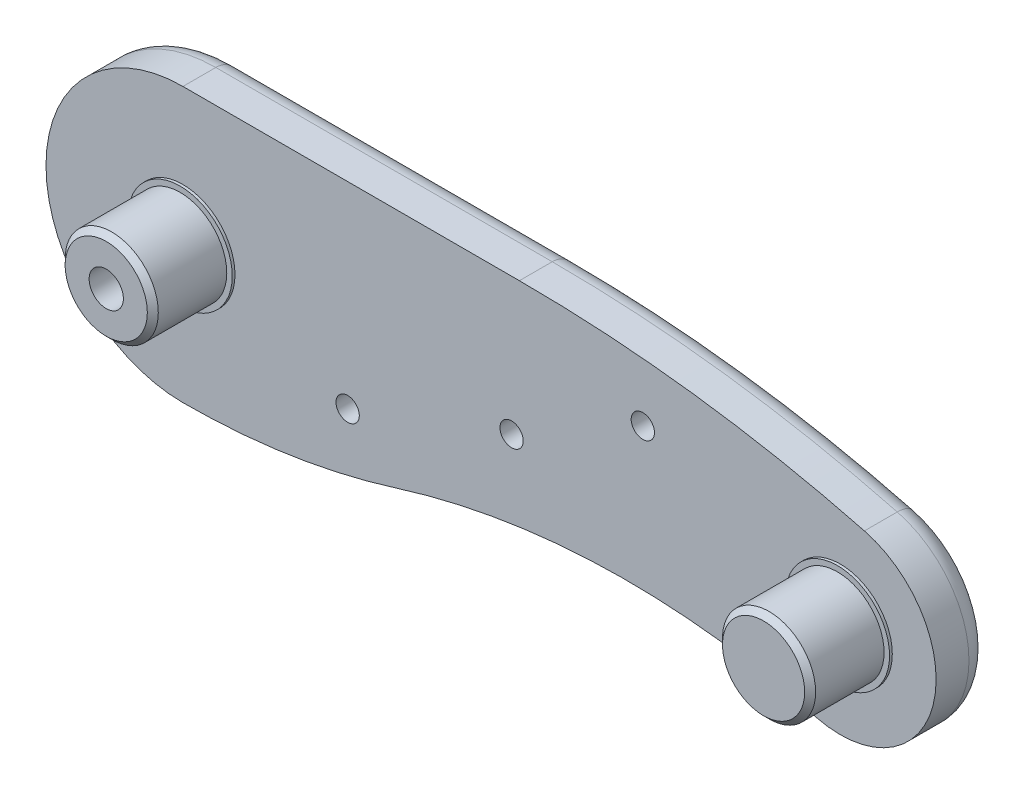
ISO-10303-21;
HEADER;
FILE_DESCRIPTION(('STEP AP214'),'2;1');
FILE_NAME('part.step','',(''),(''),'','','');
FILE_SCHEMA(('AUTOMOTIVE_DESIGN { 1 0 10303 214 1 1 1 1 }'));
ENDSEC;
DATA;
#1=APPLICATION_CONTEXT('core data for automotive mechanical design processes');
#2=APPLICATION_PROTOCOL_DEFINITION('international standard','automotive_design',2000,#1);
#3=PRODUCT_CONTEXT('',#1,'mechanical');
#4=PRODUCT('Part','Part','',(#3));
#5=PRODUCT_RELATED_PRODUCT_CATEGORY('part','',(#4));
#6=PRODUCT_DEFINITION_FORMATION('','',#4);
#7=PRODUCT_DEFINITION_CONTEXT('part definition',#1,'design');
#8=PRODUCT_DEFINITION('design','',#6,#7);
#9=PRODUCT_DEFINITION_SHAPE('','',#8);
#10=(LENGTH_UNIT() NAMED_UNIT(*) SI_UNIT(.MILLI.,.METRE.));
#11=(NAMED_UNIT(*) PLANE_ANGLE_UNIT() SI_UNIT($,.RADIAN.));
#12=(NAMED_UNIT(*) SI_UNIT($,.STERADIAN.) SOLID_ANGLE_UNIT());
#13=UNCERTAINTY_MEASURE_WITH_UNIT(LENGTH_MEASURE(1.E-05),#10,'distance_accuracy_value','');
#14=(GEOMETRIC_REPRESENTATION_CONTEXT(3) GLOBAL_UNCERTAINTY_ASSIGNED_CONTEXT((#13)) GLOBAL_UNIT_ASSIGNED_CONTEXT((#10,
#11,#12)) REPRESENTATION_CONTEXT('',''));
#15=CARTESIAN_POINT('',(0.,0.,0.));
#16=DIRECTION('',(0.,0.,1.));
#17=DIRECTION('',(1.,0.,0.));
#18=AXIS2_PLACEMENT_3D('',#15,#16,#17);
#19=CARTESIAN_POINT('',(0.,0.,-4.));
#20=DIRECTION('',(0.,0.,-1.));
#21=DIRECTION('',(-1.,0.,0.));
#22=AXIS2_PLACEMENT_3D('',#19,#20,#21);
#23=PLANE('',#22);
#24=CARTESIAN_POINT('',(0.,0.,-4.));
#25=DIRECTION('',(0.,0.,-1.));
#26=DIRECTION('',(-1.,0.,0.));
#27=AXIS2_PLACEMENT_3D('',#24,#25,#26);
#28=CIRCLE('',#27,18.);
#29=CARTESIAN_POINT('',(-18.,0.,-4.));
#30=VERTEX_POINT('',#29);
#31=EDGE_CURVE('E57',#30,#30,#28,.F.);
#32=ORIENTED_EDGE('',*,*,#31,.T.);
#33=EDGE_LOOP('',(#32));
#34=FACE_BOUND('',#33,.T.);
#35=CARTESIAN_POINT('',(30.0701638651491,-10.9446445864214,-4.));
#36=DIRECTION('',(0.,0.,-1.));
#37=DIRECTION('',(-1.,0.,0.));
#38=AXIS2_PLACEMENT_3D('',#35,#36,#37);
#39=CIRCLE('',#38,3.75);
#40=CARTESIAN_POINT('',(26.3201638651491,-10.9446445864214,-4.));
#41=VERTEX_POINT('',#40);
#42=EDGE_CURVE('E379',#41,#41,#39,.T.);
#43=ORIENTED_EDGE('',*,*,#42,.F.);
#44=EDGE_LOOP('',(#43));
#45=FACE_BOUND('',#44,.T.);
#46=CARTESIAN_POINT('',(60.,0.,-4.));
#47=DIRECTION('',(0.,0.,-1.));
#48=DIRECTION('',(-1.,0.,0.));
#49=AXIS2_PLACEMENT_3D('',#46,#47,#48);
#50=CIRCLE('',#49,3.75000000000001);
#51=CARTESIAN_POINT('',(56.25,0.,-4.));
#52=VERTEX_POINT('',#51);
#53=EDGE_CURVE('E371',#52,#52,#50,.T.);
#54=ORIENTED_EDGE('',*,*,#53,.F.);
#55=EDGE_LOOP('',(#54));
#56=FACE_BOUND('',#55,.T.);
#57=CARTESIAN_POINT('',(83.9535089505867,13.2969295284196,-4.));
#58=DIRECTION('',(0.,0.,-1.));
#59=DIRECTION('',(-1.,0.,0.));
#60=AXIS2_PLACEMENT_3D('',#57,#58,#59);
#61=CIRCLE('',#60,3.75000000000001);
#62=CARTESIAN_POINT('',(80.2035089505867,13.2969295284196,-4.));
#63=VERTEX_POINT('',#62);
#64=EDGE_CURVE('E367',#63,#63,#61,.T.);
#65=ORIENTED_EDGE('',*,*,#64,.F.);
#66=EDGE_LOOP('',(#65));
#67=FACE_BOUND('',#66,.T.);
#68=CARTESIAN_POINT('',(0.,105.,-4.));
#69=DIRECTION('',(0.,0.,-1.));
#70=DIRECTION('',(-1.,0.,0.));
#71=AXIS2_PLACEMENT_3D('',#68,#69,#70);
#72=CIRCLE('',#71,126.);
#73=CARTESIAN_POINT('',(37.7742430285016,-15.2044365388553,-4.));
#74=VERTEX_POINT('',#73);
#75=CARTESIAN_POINT('',(0.,-21.,-4.));
#76=VERTEX_POINT('',#75);
#77=EDGE_CURVE('E210',#74,#76,#72,.T.);
#78=ORIENTED_EDGE('',*,*,#77,.T.);
#79=CARTESIAN_POINT('',(0.,0.,-4.));
#80=DIRECTION('',(0.,0.,-1.));
#81=DIRECTION('',(-1.,0.,0.));
#82=AXIS2_PLACEMENT_3D('',#79,#80,#81);
#83=CIRCLE('',#82,21.);
#84=CARTESIAN_POINT('',(0.,21.,-4.));
#85=VERTEX_POINT('',#84);
#86=EDGE_CURVE('E213',#76,#85,#83,.T.);
#87=ORIENTED_EDGE('',*,*,#86,.T.);
#88=DIRECTION('',(1.,0.,0.));
#89=VECTOR('',#88,1.);
#90=CARTESIAN_POINT('',(0.,21.,-4.));
#91=LINE('',#90,#89);
#92=CARTESIAN_POINT('',(61.4231274307002,21.,-4.));
#93=VERTEX_POINT('',#92);
#94=EDGE_CURVE('E134',#85,#93,#91,.T.);
#95=ORIENTED_EDGE('',*,*,#94,.T.);
#96=CARTESIAN_POINT('',(61.4231274307002,-225.,-4.));
#97=DIRECTION('',(0.,0.,-1.));
#98=DIRECTION('',(-1.,0.,0.));
#99=AXIS2_PLACEMENT_3D('',#96,#97,#98);
#100=CIRCLE('',#99,246.);
#101=CARTESIAN_POINT('',(123.401237762088,13.0645161290323,-4.));
#102=VERTEX_POINT('',#101);
#103=EDGE_CURVE('E201',#93,#102,#100,.T.);
#104=ORIENTED_EDGE('',*,*,#103,.T.);
#105=CARTESIAN_POINT('',(120.,0.,-4.));
#106=DIRECTION('',(0.,0.,-1.));
#107=DIRECTION('',(-1.,0.,0.));
#108=AXIS2_PLACEMENT_3D('',#105,#106,#107);
#109=CIRCLE('',#108,13.5);
#110=CARTESIAN_POINT('',(116.652411984827,-13.0783658948918,-4.));
#111=VERTEX_POINT('',#110);
#112=EDGE_CURVE('E204',#102,#111,#109,.T.);
#113=ORIENTED_EDGE('',*,*,#112,.T.);
#114=CARTESIAN_POINT('',(80.9448064896462,-152.580935440404,-4.));
#115=DIRECTION('',(0.,0.,-1.));
#116=DIRECTION('',(-1.,0.,0.));
#117=AXIS2_PLACEMENT_3D('',#114,#115,#116);
#118=CIRCLE('',#117,144.);
#119=EDGE_CURVE('E207',#111,#74,#118,.F.);
#120=ORIENTED_EDGE('',*,*,#119,.T.);
#121=EDGE_LOOP('',(#78,#87,#95,#104,#113,#120));
#122=FACE_BOUND('',#121,.T.);
#123=ADVANCED_FACE('F47',(#34,#45,#56,#67,#122),#23,.T.);
#124=CARTESIAN_POINT('',(0.,0.,20.));
#125=DIRECTION('',(0.,0.,-1.));
#126=DIRECTION('',(-1.,0.,0.));
#127=AXIS2_PLACEMENT_3D('',#124,#125,#126);
#128=CYLINDRICAL_SURFACE('',#127,1.625);
#129=CARTESIAN_POINT('',(0.,0.,0.));
#130=DIRECTION('',(0.,0.,-1.));
#131=DIRECTION('',(-1.,0.,0.));
#132=AXIS2_PLACEMENT_3D('',#129,#130,#131);
#133=CIRCLE('',#132,1.625);
#134=CARTESIAN_POINT('',(-1.625,0.,0.));
#135=VERTEX_POINT('',#134);
#136=EDGE_CURVE('E275',#135,#135,#133,.T.);
#137=ORIENTED_EDGE('',*,*,#136,.T.);
#138=EDGE_LOOP('',(#137));
#139=FACE_BOUND('',#138,.T.);
#140=CARTESIAN_POINT('',(0.,0.,3.));
#141=DIRECTION('',(0.,0.,1.));
#142=DIRECTION('',(1.,0.,0.));
#143=AXIS2_PLACEMENT_3D('',#140,#141,#142);
#144=CIRCLE('',#143,1.625);
#145=CARTESIAN_POINT('',(1.625,0.,3.));
#146=VERTEX_POINT('',#145);
#147=EDGE_CURVE('E272',#146,#146,#144,.F.);
#148=ORIENTED_EDGE('',*,*,#147,.F.);
#149=EDGE_LOOP('',(#148));
#150=FACE_BOUND('',#149,.T.);
#151=ADVANCED_FACE('F402',(#139,#150),#128,.F.);
#152=CARTESIAN_POINT('',(0.,0.,6.));
#153=DIRECTION('',(0.,0.,1.));
#154=DIRECTION('',(1.,0.,0.));
#155=AXIS2_PLACEMENT_3D('',#152,#153,#154);
#156=PLANE('',#155);
#157=CARTESIAN_POINT('',(0.,0.,6.));
#158=DIRECTION('',(0.,0.,1.));
#159=DIRECTION('',(1.,0.,0.));
#160=AXIS2_PLACEMENT_3D('',#157,#158,#159);
#161=CIRCLE('',#160,9.5);
#162=CARTESIAN_POINT('',(9.5,0.,6.));
#163=VERTEX_POINT('',#162);
#164=EDGE_CURVE('E357',#163,#163,#161,.T.);
#165=ORIENTED_EDGE('',*,*,#164,.F.);
#166=EDGE_LOOP('',(#165));
#167=FACE_BOUND('',#166,.T.);
#168=CARTESIAN_POINT('',(83.9535089505867,13.2969295284196,6.));
#169=DIRECTION('',(0.,0.,1.));
#170=DIRECTION('',(1.,0.,0.));
#171=AXIS2_PLACEMENT_3D('',#168,#169,#170);
#172=CIRCLE('',#171,2.125);
#173=CARTESIAN_POINT('',(86.0785089505867,13.2969295284196,6.));
#174=VERTEX_POINT('',#173);
#175=EDGE_CURVE('E155',#174,#174,#172,.T.);
#176=ORIENTED_EDGE('',*,*,#175,.F.);
#177=EDGE_LOOP('',(#176));
#178=FACE_BOUND('',#177,.T.);
#179=CARTESIAN_POINT('',(60.,0.,6.));
#180=DIRECTION('',(0.,0.,1.));
#181=DIRECTION('',(1.,0.,0.));
#182=AXIS2_PLACEMENT_3D('',#179,#180,#181);
#183=CIRCLE('',#182,2.125);
#184=CARTESIAN_POINT('',(62.125,0.,6.));
#185=VERTEX_POINT('',#184);
#186=EDGE_CURVE('E389',#185,#185,#183,.T.);
#187=ORIENTED_EDGE('',*,*,#186,.F.);
#188=EDGE_LOOP('',(#187));
#189=FACE_BOUND('',#188,.T.);
#190=CARTESIAN_POINT('',(30.0701638651491,-10.9446445864214,6.));
#191=DIRECTION('',(0.,0.,1.));
#192=DIRECTION('',(1.,0.,0.));
#193=AXIS2_PLACEMENT_3D('',#190,#191,#192);
#194=CIRCLE('',#193,2.125);
#195=CARTESIAN_POINT('',(32.1951638651491,-10.9446445864214,6.));
#196=VERTEX_POINT('',#195);
#197=EDGE_CURVE('E198',#196,#196,#194,.T.);
#198=ORIENTED_EDGE('',*,*,#197,.F.);
#199=EDGE_LOOP('',(#198));
#200=FACE_BOUND('',#199,.T.);
#201=DIRECTION('',(1.,0.,0.));
#202=VECTOR('',#201,1.);
#203=CARTESIAN_POINT('',(0.,25.,6.));
#204=LINE('',#203,#202);
#205=CARTESIAN_POINT('',(0.,25.,6.));
#206=VERTEX_POINT('',#205);
#207=CARTESIAN_POINT('',(61.4231274307002,25.,6.));
#208=VERTEX_POINT('',#207);
#209=EDGE_CURVE('E126',#206,#208,#204,.T.);
#210=ORIENTED_EDGE('',*,*,#209,.F.);
#211=CARTESIAN_POINT('',(0.,0.,6.));
#212=DIRECTION('',(0.,0.,1.));
#213=DIRECTION('',(1.,0.,0.));
#214=AXIS2_PLACEMENT_3D('',#211,#212,#213);
#215=CIRCLE('',#214,25.);
#216=CARTESIAN_POINT('',(0.,-25.,6.));
#217=VERTEX_POINT('',#216);
#218=EDGE_CURVE('E138',#206,#217,#215,.T.);
#219=ORIENTED_EDGE('',*,*,#218,.T.);
#220=CARTESIAN_POINT('',(0.,105.,6.));
#221=DIRECTION('',(0.,0.,1.));
#222=DIRECTION('',(1.,0.,0.));
#223=AXIS2_PLACEMENT_3D('',#220,#221,#222);
#224=CIRCLE('',#223,130.);
#225=CARTESIAN_POINT('',(38.9734253468667,-19.0204503972317,6.));
#226=VERTEX_POINT('',#225);
#227=EDGE_CURVE('E144',#217,#226,#224,.T.);
#228=ORIENTED_EDGE('',*,*,#227,.T.);
#229=CARTESIAN_POINT('',(80.9448064896462,-152.580935440404,6.));
#230=DIRECTION('',(0.,0.,1.));
#231=DIRECTION('',(1.,0.,0.));
#232=AXIS2_PLACEMENT_3D('',#229,#230,#231);
#233=CIRCLE('',#232,140.);
#234=CARTESIAN_POINT('',(115.660534054405,-16.9534372711561,6.));
#235=VERTEX_POINT('',#234);
#236=EDGE_CURVE('E161',#235,#226,#233,.T.);
#237=ORIENTED_EDGE('',*,*,#236,.F.);
#238=CARTESIAN_POINT('',(120.,0.,6.));
#239=DIRECTION('',(0.,0.,1.));
#240=DIRECTION('',(1.,0.,0.));
#241=AXIS2_PLACEMENT_3D('',#238,#239,#240);
#242=CIRCLE('',#241,17.5);
#243=CARTESIAN_POINT('',(124.409011913818,16.9354838709678,6.));
#244=VERTEX_POINT('',#243);
#245=EDGE_CURVE('E165',#235,#244,#242,.T.);
#246=ORIENTED_EDGE('',*,*,#245,.T.);
#247=CARTESIAN_POINT('',(61.4231274307002,-225.,6.));
#248=DIRECTION('',(0.,0.,1.));
#249=DIRECTION('',(1.,0.,0.));
#250=AXIS2_PLACEMENT_3D('',#247,#248,#249);
#251=CIRCLE('',#250,250.);
#252=EDGE_CURVE('E149',#208,#244,#251,.F.);
#253=ORIENTED_EDGE('',*,*,#252,.F.);
#254=EDGE_LOOP('',(#210,#219,#228,#237,#246,#253));
#255=FACE_BOUND('',#254,.T.);
#256=CARTESIAN_POINT('',(120.,0.,6.));
#257=DIRECTION('',(0.,0.,1.));
#258=DIRECTION('',(1.,0.,0.));
#259=AXIS2_PLACEMENT_3D('',#256,#257,#258);
#260=CIRCLE('',#259,9.50000000000001);
#261=CARTESIAN_POINT('',(129.5,0.,6.));
#262=VERTEX_POINT('',#261);
#263=EDGE_CURVE('E342',#262,#262,#260,.T.);
#264=ORIENTED_EDGE('',*,*,#263,.F.);
#265=EDGE_LOOP('',(#264));
#266=FACE_BOUND('',#265,.T.);
#267=ADVANCED_FACE('F146',(#167,#178,#189,#200,#255,#266),#156,.T.);
#268=CARTESIAN_POINT('',(30.0701638651491,-10.9446445864214,20.));
#269=DIRECTION('',(0.,0.,-1.));
#270=DIRECTION('',(-1.,0.,0.));
#271=AXIS2_PLACEMENT_3D('',#268,#269,#270);
#272=CYLINDRICAL_SURFACE('',#271,2.125);
#273=ORIENTED_EDGE('',*,*,#197,.T.);
#274=EDGE_LOOP('',(#273));
#275=FACE_BOUND('',#274,.T.);
#276=CARTESIAN_POINT('',(30.0701638651491,-10.9446445864214,0.25));
#277=DIRECTION('',(0.,0.,-1.));
#278=DIRECTION('',(-1.,0.,0.));
#279=AXIS2_PLACEMENT_3D('',#276,#277,#278);
#280=CIRCLE('',#279,2.125);
#281=CARTESIAN_POINT('',(27.9451638651491,-10.9446445864214,0.25));
#282=VERTEX_POINT('',#281);
#283=EDGE_CURVE('E194',#282,#282,#280,.F.);
#284=ORIENTED_EDGE('',*,*,#283,.F.);
#285=EDGE_LOOP('',(#284));
#286=FACE_BOUND('',#285,.T.);
#287=ADVANCED_FACE('F401',(#275,#286),#272,.F.);
#288=CARTESIAN_POINT('',(60.,0.,20.));
#289=DIRECTION('',(0.,0.,-1.));
#290=DIRECTION('',(-1.,0.,0.));
#291=AXIS2_PLACEMENT_3D('',#288,#289,#290);
#292=CYLINDRICAL_SURFACE('',#291,2.125);
#293=ORIENTED_EDGE('',*,*,#186,.T.);
#294=EDGE_LOOP('',(#293));
#295=FACE_BOUND('',#294,.T.);
#296=CARTESIAN_POINT('',(60.,0.,0.25));
#297=DIRECTION('',(0.,0.,-1.));
#298=DIRECTION('',(-1.,0.,0.));
#299=AXIS2_PLACEMENT_3D('',#296,#297,#298);
#300=CIRCLE('',#299,2.125);
#301=CARTESIAN_POINT('',(57.875,0.,0.25));
#302=VERTEX_POINT('',#301);
#303=EDGE_CURVE('E189',#302,#302,#300,.F.);
#304=ORIENTED_EDGE('',*,*,#303,.F.);
#305=EDGE_LOOP('',(#304));
#306=FACE_BOUND('',#305,.T.);
#307=ADVANCED_FACE('F411',(#295,#306),#292,.F.);
#308=CARTESIAN_POINT('',(83.9535089505867,13.2969295284196,20.));
#309=DIRECTION('',(0.,0.,-1.));
#310=DIRECTION('',(-1.,0.,0.));
#311=AXIS2_PLACEMENT_3D('',#308,#309,#310);
#312=CYLINDRICAL_SURFACE('',#311,2.125);
#313=ORIENTED_EDGE('',*,*,#175,.T.);
#314=EDGE_LOOP('',(#313));
#315=FACE_BOUND('',#314,.T.);
#316=CARTESIAN_POINT('',(83.9535089505867,13.2969295284196,0.25));
#317=DIRECTION('',(0.,0.,-1.));
#318=DIRECTION('',(-1.,0.,0.));
#319=AXIS2_PLACEMENT_3D('',#316,#317,#318);
#320=CIRCLE('',#319,2.125);
#321=CARTESIAN_POINT('',(81.8285089505867,13.2969295284196,0.25));
#322=VERTEX_POINT('',#321);
#323=EDGE_CURVE('E185',#322,#322,#320,.F.);
#324=ORIENTED_EDGE('',*,*,#323,.F.);
#325=EDGE_LOOP('',(#324));
#326=FACE_BOUND('',#325,.T.);
#327=ADVANCED_FACE('F396',(#315,#326),#312,.F.);
#328=CARTESIAN_POINT('',(0.,25.,6.));
#329=DIRECTION('',(0.,1.,0.));
#330=DIRECTION('',(0.,0.,1.));
#331=AXIS2_PLACEMENT_3D('',#328,#329,#330);
#332=PLANE('',#331);
#333=DIRECTION('',(0.,0.,-1.));
#334=VECTOR('',#333,1.);
#335=CARTESIAN_POINT('',(61.4231274307002,25.,6.));
#336=LINE('',#335,#334);
#337=CARTESIAN_POINT('',(61.4231274307002,25.,0.));
#338=VERTEX_POINT('',#337);
#339=EDGE_CURVE('E170',#208,#338,#336,.T.);
#340=ORIENTED_EDGE('',*,*,#339,.T.);
#341=DIRECTION('',(1.,0.,0.));
#342=VECTOR('',#341,1.);
#343=CARTESIAN_POINT('',(0.,25.,0.));
#344=LINE('',#343,#342);
#345=CARTESIAN_POINT('',(0.,25.,0.));
#346=VERTEX_POINT('',#345);
#347=EDGE_CURVE('E129',#338,#346,#344,.F.);
#348=ORIENTED_EDGE('',*,*,#347,.T.);
#349=DIRECTION('',(0.,0.,-1.));
#350=VECTOR('',#349,1.);
#351=CARTESIAN_POINT('',(0.,25.,6.));
#352=LINE('',#351,#350);
#353=EDGE_CURVE('E122',#206,#346,#352,.T.);
#354=ORIENTED_EDGE('',*,*,#353,.F.);
#355=ORIENTED_EDGE('',*,*,#209,.T.);
#356=EDGE_LOOP('',(#340,#348,#354,#355));
#357=FACE_BOUND('',#356,.T.);
#358=ADVANCED_FACE('F124',(#357),#332,.T.);
#359=CARTESIAN_POINT('',(0.,0.,6.));
#360=DIRECTION('',(0.,0.,-1.));
#361=DIRECTION('',(-1.,0.,0.));
#362=AXIS2_PLACEMENT_3D('',#359,#360,#361);
#363=CYLINDRICAL_SURFACE('',#362,25.);
#364=ORIENTED_EDGE('',*,*,#353,.T.);
#365=CARTESIAN_POINT('',(0.,0.,0.));
#366=DIRECTION('',(0.,0.,-1.));
#367=DIRECTION('',(-1.,0.,0.));
#368=AXIS2_PLACEMENT_3D('',#365,#366,#367);
#369=CIRCLE('',#368,25.);
#370=CARTESIAN_POINT('',(0.,-25.,0.));
#371=VERTEX_POINT('',#370);
#372=EDGE_CURVE('E217',#346,#371,#369,.F.);
#373=ORIENTED_EDGE('',*,*,#372,.T.);
#374=DIRECTION('',(0.,0.,-1.));
#375=VECTOR('',#374,1.);
#376=CARTESIAN_POINT('',(0.,-25.,6.));
#377=LINE('',#376,#375);
#378=EDGE_CURVE('E135',#217,#371,#377,.T.);
#379=ORIENTED_EDGE('',*,*,#378,.F.);
#380=ORIENTED_EDGE('',*,*,#218,.F.);
#381=EDGE_LOOP('',(#364,#373,#379,#380));
#382=FACE_BOUND('',#381,.T.);
#383=ADVANCED_FACE('F139',(#382),#363,.T.);
#384=CARTESIAN_POINT('',(0.,105.,6.));
#385=DIRECTION('',(0.,0.,-1.));
#386=DIRECTION('',(-1.,0.,0.));
#387=AXIS2_PLACEMENT_3D('',#384,#385,#386);
#388=CYLINDRICAL_SURFACE('',#387,130.);
#389=ORIENTED_EDGE('',*,*,#378,.T.);
#390=CARTESIAN_POINT('',(0.,105.,0.));
#391=DIRECTION('',(0.,0.,-1.));
#392=DIRECTION('',(-1.,0.,0.));
#393=AXIS2_PLACEMENT_3D('',#390,#391,#392);
#394=CIRCLE('',#393,130.);
#395=CARTESIAN_POINT('',(38.9734253468667,-19.0204503972317,0.));
#396=VERTEX_POINT('',#395);
#397=EDGE_CURVE('E220',#371,#396,#394,.F.);
#398=ORIENTED_EDGE('',*,*,#397,.T.);
#399=DIRECTION('',(0.,0.,-1.));
#400=VECTOR('',#399,1.);
#401=CARTESIAN_POINT('',(38.9734253468667,-19.0204503972317,6.));
#402=LINE('',#401,#400);
#403=EDGE_CURVE('E179',#226,#396,#402,.T.);
#404=ORIENTED_EDGE('',*,*,#403,.F.);
#405=ORIENTED_EDGE('',*,*,#227,.F.);
#406=EDGE_LOOP('',(#389,#398,#404,#405));
#407=FACE_BOUND('',#406,.T.);
#408=ADVANCED_FACE('F461',(#407),#388,.T.);
#409=CARTESIAN_POINT('',(80.9448064896462,-152.580935440404,6.));
#410=DIRECTION('',(0.,0.,-1.));
#411=DIRECTION('',(-1.,0.,0.));
#412=AXIS2_PLACEMENT_3D('',#409,#410,#411);
#413=CYLINDRICAL_SURFACE('',#412,140.);
#414=ORIENTED_EDGE('',*,*,#403,.T.);
#415=CARTESIAN_POINT('',(80.9448064896462,-152.580935440404,0.));
#416=DIRECTION('',(0.,0.,-1.));
#417=DIRECTION('',(-1.,0.,0.));
#418=AXIS2_PLACEMENT_3D('',#415,#416,#417);
#419=CIRCLE('',#418,140.);
#420=CARTESIAN_POINT('',(115.660534054405,-16.9534372711561,0.));
#421=VERTEX_POINT('',#420);
#422=EDGE_CURVE('E223',#396,#421,#419,.T.);
#423=ORIENTED_EDGE('',*,*,#422,.T.);
#424=DIRECTION('',(0.,0.,-1.));
#425=VECTOR('',#424,1.);
#426=CARTESIAN_POINT('',(115.660534054405,-16.9534372711561,6.));
#427=LINE('',#426,#425);
#428=EDGE_CURVE('E176',#235,#421,#427,.T.);
#429=ORIENTED_EDGE('',*,*,#428,.F.);
#430=ORIENTED_EDGE('',*,*,#236,.T.);
#431=EDGE_LOOP('',(#414,#423,#429,#430));
#432=FACE_BOUND('',#431,.T.);
#433=ADVANCED_FACE('F458',(#432),#413,.F.);
#434=CARTESIAN_POINT('',(120.,0.,6.));
#435=DIRECTION('',(0.,0.,-1.));
#436=DIRECTION('',(-1.,0.,0.));
#437=AXIS2_PLACEMENT_3D('',#434,#435,#436);
#438=CYLINDRICAL_SURFACE('',#437,17.5);
#439=ORIENTED_EDGE('',*,*,#428,.T.);
#440=CARTESIAN_POINT('',(120.,0.,0.));
#441=DIRECTION('',(0.,0.,-1.));
#442=DIRECTION('',(-1.,0.,0.));
#443=AXIS2_PLACEMENT_3D('',#440,#441,#442);
#444=CIRCLE('',#443,17.5);
#445=CARTESIAN_POINT('',(124.409011913818,16.9354838709678,0.));
#446=VERTEX_POINT('',#445);
#447=EDGE_CURVE('E72',#421,#446,#444,.F.);
#448=ORIENTED_EDGE('',*,*,#447,.T.);
#449=DIRECTION('',(0.,0.,-1.));
#450=VECTOR('',#449,1.);
#451=CARTESIAN_POINT('',(124.409011913818,16.9354838709678,6.));
#452=LINE('',#451,#450);
#453=EDGE_CURVE('E173',#244,#446,#452,.T.);
#454=ORIENTED_EDGE('',*,*,#453,.F.);
#455=ORIENTED_EDGE('',*,*,#245,.F.);
#456=EDGE_LOOP('',(#439,#448,#454,#455));
#457=FACE_BOUND('',#456,.T.);
#458=ADVANCED_FACE('F455',(#457),#438,.T.);
#459=CARTESIAN_POINT('',(61.4231274307002,-225.,6.));
#460=DIRECTION('',(0.,0.,-1.));
#461=DIRECTION('',(-1.,0.,0.));
#462=AXIS2_PLACEMENT_3D('',#459,#460,#461);
#463=CYLINDRICAL_SURFACE('',#462,250.);
#464=ORIENTED_EDGE('',*,*,#453,.T.);
#465=CARTESIAN_POINT('',(61.4231274307002,-225.,0.));
#466=DIRECTION('',(0.,0.,-1.));
#467=DIRECTION('',(-1.,0.,0.));
#468=AXIS2_PLACEMENT_3D('',#465,#466,#467);
#469=CIRCLE('',#468,250.);
#470=EDGE_CURVE('E64',#446,#338,#469,.F.);
#471=ORIENTED_EDGE('',*,*,#470,.T.);
#472=ORIENTED_EDGE('',*,*,#339,.F.);
#473=ORIENTED_EDGE('',*,*,#252,.T.);
#474=EDGE_LOOP('',(#464,#471,#472,#473));
#475=FACE_BOUND('',#474,.T.);
#476=ADVANCED_FACE('F446',(#475),#463,.T.);
#477=CARTESIAN_POINT('',(0.,0.,-4.));
#478=DIRECTION('',(0.,0.,1.));
#479=DIRECTION('',(1.,0.,0.));
#480=AXIS2_PLACEMENT_3D('',#477,#478,#479);
#481=CYLINDRICAL_SURFACE('',#480,10.);
#482=CARTESIAN_POINT('',(0.,0.,0.));
#483=DIRECTION('',(0.,0.,-1.));
#484=DIRECTION('',(-1.,0.,0.));
#485=AXIS2_PLACEMENT_3D('',#482,#483,#484);
#486=CIRCLE('',#485,10.);
#487=CARTESIAN_POINT('',(-10.,0.,0.));
#488=VERTEX_POINT('',#487);
#489=EDGE_CURVE('E151',#488,#488,#486,.T.);
#490=ORIENTED_EDGE('',*,*,#489,.F.);
#491=EDGE_LOOP('',(#490));
#492=FACE_BOUND('',#491,.T.);
#493=CARTESIAN_POINT('',(0.,0.,-6.));
#494=DIRECTION('',(0.,0.,-1.));
#495=DIRECTION('',(-1.,0.,0.));
#496=AXIS2_PLACEMENT_3D('',#493,#494,#495);
#497=CIRCLE('',#496,10.);
#498=CARTESIAN_POINT('',(-10.,0.,-6.));
#499=VERTEX_POINT('',#498);
#500=EDGE_CURVE('E294',#499,#499,#497,.T.);
#501=ORIENTED_EDGE('',*,*,#500,.T.);
#502=EDGE_LOOP('',(#501));
#503=FACE_BOUND('',#502,.T.);
#504=ADVANCED_FACE('F443',(#492,#503),#481,.F.);
#505=CARTESIAN_POINT('',(0.,0.,0.));
#506=DIRECTION('',(0.,0.,1.));
#507=DIRECTION('',(1.,0.,0.));
#508=AXIS2_PLACEMENT_3D('',#505,#506,#507);
#509=PLANE('',#508);
#510=CARTESIAN_POINT('',(0.,7.42,0.));
#511=DIRECTION('',(0.,0.,-1.));
#512=DIRECTION('',(-1.,0.,0.));
#513=AXIS2_PLACEMENT_3D('',#510,#511,#512);
#514=CIRCLE('',#513,1.);
#515=CARTESIAN_POINT('',(-1.,7.42,0.));
#516=VERTEX_POINT('',#515);
#517=EDGE_CURVE('E309',#516,#516,#514,.T.);
#518=ORIENTED_EDGE('',*,*,#517,.F.);
#519=EDGE_LOOP('',(#518));
#520=FACE_BOUND('',#519,.T.);
#521=CARTESIAN_POINT('',(-7.42,0.,0.));
#522=DIRECTION('',(0.,0.,-1.));
#523=DIRECTION('',(-1.,0.,0.));
#524=AXIS2_PLACEMENT_3D('',#521,#522,#523);
#525=CIRCLE('',#524,1.00000000000001);
#526=CARTESIAN_POINT('',(-8.42000000000001,0.,0.));
#527=VERTEX_POINT('',#526);
#528=EDGE_CURVE('E313',#527,#527,#525,.T.);
#529=ORIENTED_EDGE('',*,*,#528,.F.);
#530=EDGE_LOOP('',(#529));
#531=FACE_BOUND('',#530,.T.);
#532=CARTESIAN_POINT('',(0.,-7.42,0.));
#533=DIRECTION('',(0.,0.,-1.));
#534=DIRECTION('',(-1.,0.,0.));
#535=AXIS2_PLACEMENT_3D('',#532,#533,#534);
#536=CIRCLE('',#535,1.);
#537=CARTESIAN_POINT('',(-1.,-7.42,0.));
#538=VERTEX_POINT('',#537);
#539=EDGE_CURVE('E321',#538,#538,#536,.T.);
#540=ORIENTED_EDGE('',*,*,#539,.F.);
#541=EDGE_LOOP('',(#540));
#542=FACE_BOUND('',#541,.T.);
#543=CARTESIAN_POINT('',(7.42,0.,0.));
#544=DIRECTION('',(0.,0.,-1.));
#545=DIRECTION('',(-1.,0.,0.));
#546=AXIS2_PLACEMENT_3D('',#543,#544,#545);
#547=CIRCLE('',#546,1.);
#548=CARTESIAN_POINT('',(6.42,0.,0.));
#549=VERTEX_POINT('',#548);
#550=EDGE_CURVE('E301',#549,#549,#547,.T.);
#551=ORIENTED_EDGE('',*,*,#550,.F.);
#552=EDGE_LOOP('',(#551));
#553=FACE_BOUND('',#552,.T.);
#554=ORIENTED_EDGE('',*,*,#136,.F.);
#555=EDGE_LOOP('',(#554));
#556=FACE_BOUND('',#555,.T.);
#557=ORIENTED_EDGE('',*,*,#489,.T.);
#558=EDGE_LOOP('',(#557));
#559=FACE_BOUND('',#558,.T.);
#560=ADVANCED_FACE('F445',(#520,#531,#542,#553,#556,#559),#509,.F.);
#561=CARTESIAN_POINT('',(83.9535089505867,13.2969295284196,0.25));
#562=DIRECTION('',(0.,0.,-1.));
#563=DIRECTION('',(-1.,0.,0.));
#564=AXIS2_PLACEMENT_3D('',#561,#562,#563);
#565=PLANE('',#564);
#566=CARTESIAN_POINT('',(83.9535089505867,13.2969295284196,0.25));
#567=DIRECTION('',(0.,0.,-1.));
#568=DIRECTION('',(-1.,0.,0.));
#569=AXIS2_PLACEMENT_3D('',#566,#567,#568);
#570=CIRCLE('',#569,3.75000000000001);
#571=CARTESIAN_POINT('',(80.2035089505867,13.2969295284196,0.25));
#572=VERTEX_POINT('',#571);
#573=EDGE_CURVE('E190',#572,#572,#570,.T.);
#574=ORIENTED_EDGE('',*,*,#573,.T.);
#575=EDGE_LOOP('',(#574));
#576=FACE_BOUND('',#575,.T.);
#577=ORIENTED_EDGE('',*,*,#323,.T.);
#578=EDGE_LOOP('',(#577));
#579=FACE_BOUND('',#578,.T.);
#580=ADVANCED_FACE('F451',(#576,#579),#565,.T.);
#581=CARTESIAN_POINT('',(83.9535089505867,13.2969295284196,0.25));
#582=DIRECTION('',(0.,0.,-1.));
#583=DIRECTION('',(-1.,0.,0.));
#584=AXIS2_PLACEMENT_3D('',#581,#582,#583);
#585=CYLINDRICAL_SURFACE('',#584,3.75000000000001);
#586=ORIENTED_EDGE('',*,*,#573,.F.);
#587=EDGE_LOOP('',(#586));
#588=FACE_BOUND('',#587,.T.);
#589=ORIENTED_EDGE('',*,*,#64,.T.);
#590=EDGE_LOOP('',(#589));
#591=FACE_BOUND('',#590,.T.);
#592=ADVANCED_FACE('F590',(#588,#591),#585,.F.);
#593=CARTESIAN_POINT('',(60.,0.,0.25));
#594=DIRECTION('',(0.,0.,-1.));
#595=DIRECTION('',(-1.,0.,0.));
#596=AXIS2_PLACEMENT_3D('',#593,#594,#595);
#597=PLANE('',#596);
#598=CARTESIAN_POINT('',(60.,0.,0.25));
#599=DIRECTION('',(0.,0.,-1.));
#600=DIRECTION('',(-1.,0.,0.));
#601=AXIS2_PLACEMENT_3D('',#598,#599,#600);
#602=CIRCLE('',#601,3.75000000000001);
#603=CARTESIAN_POINT('',(56.25,0.,0.25));
#604=VERTEX_POINT('',#603);
#605=EDGE_CURVE('E375',#604,#604,#602,.T.);
#606=ORIENTED_EDGE('',*,*,#605,.T.);
#607=EDGE_LOOP('',(#606));
#608=FACE_BOUND('',#607,.T.);
#609=ORIENTED_EDGE('',*,*,#303,.T.);
#610=EDGE_LOOP('',(#609));
#611=FACE_BOUND('',#610,.T.);
#612=ADVANCED_FACE('F428',(#608,#611),#597,.T.);
#613=CARTESIAN_POINT('',(60.,0.,0.25));
#614=DIRECTION('',(0.,0.,-1.));
#615=DIRECTION('',(-1.,0.,0.));
#616=AXIS2_PLACEMENT_3D('',#613,#614,#615);
#617=CYLINDRICAL_SURFACE('',#616,3.75000000000001);
#618=ORIENTED_EDGE('',*,*,#605,.F.);
#619=EDGE_LOOP('',(#618));
#620=FACE_BOUND('',#619,.T.);
#621=ORIENTED_EDGE('',*,*,#53,.T.);
#622=EDGE_LOOP('',(#621));
#623=FACE_BOUND('',#622,.T.);
#624=ADVANCED_FACE('F418',(#620,#623),#617,.F.);
#625=CARTESIAN_POINT('',(30.0701638651491,-10.9446445864214,0.25));
#626=DIRECTION('',(0.,0.,-1.));
#627=DIRECTION('',(-1.,0.,0.));
#628=AXIS2_PLACEMENT_3D('',#625,#626,#627);
#629=PLANE('',#628);
#630=CARTESIAN_POINT('',(30.0701638651491,-10.9446445864214,0.25));
#631=DIRECTION('',(0.,0.,-1.));
#632=DIRECTION('',(-1.,0.,0.));
#633=AXIS2_PLACEMENT_3D('',#630,#631,#632);
#634=CIRCLE('',#633,3.75);
#635=CARTESIAN_POINT('',(26.3201638651491,-10.9446445864214,0.25));
#636=VERTEX_POINT('',#635);
#637=EDGE_CURVE('E256',#636,#636,#634,.T.);
#638=ORIENTED_EDGE('',*,*,#637,.T.);
#639=EDGE_LOOP('',(#638));
#640=FACE_BOUND('',#639,.T.);
#641=ORIENTED_EDGE('',*,*,#283,.T.);
#642=EDGE_LOOP('',(#641));
#643=FACE_BOUND('',#642,.T.);
#644=ADVANCED_FACE('F415',(#640,#643),#629,.T.);
#645=CARTESIAN_POINT('',(30.0701638651491,-10.9446445864214,0.25));
#646=DIRECTION('',(0.,0.,-1.));
#647=DIRECTION('',(-1.,0.,0.));
#648=AXIS2_PLACEMENT_3D('',#645,#646,#647);
#649=CYLINDRICAL_SURFACE('',#648,3.75);
#650=ORIENTED_EDGE('',*,*,#637,.F.);
#651=EDGE_LOOP('',(#650));
#652=FACE_BOUND('',#651,.T.);
#653=ORIENTED_EDGE('',*,*,#42,.T.);
#654=EDGE_LOOP('',(#653));
#655=FACE_BOUND('',#654,.T.);
#656=ADVANCED_FACE('F417',(#652,#655),#649,.F.);
#657=CARTESIAN_POINT('',(120.,0.,0.));
#658=DIRECTION('',(0.,0.,-1.));
#659=DIRECTION('',(-1.,0.,0.));
#660=AXIS2_PLACEMENT_3D('',#657,#658,#659);
#661=TOROIDAL_SURFACE('',#660,13.5,4.);
#662=CARTESIAN_POINT('',(123.401237762088,13.0645161290323,0.));
#663=DIRECTION('',(-0.967741935483871,0.251943537932474,0.));
#664=DIRECTION('',(-0.251943537932474,-0.967741935483871,0.));
#665=AXIS2_PLACEMENT_3D('',#662,#663,#664);
#666=CIRCLE('',#665,4.);
#667=EDGE_CURVE('E248',#446,#102,#666,.T.);
#668=ORIENTED_EDGE('',*,*,#667,.F.);
#669=ORIENTED_EDGE('',*,*,#447,.F.);
#670=CARTESIAN_POINT('',(116.652411984827,-13.0783658948918,0.));
#671=DIRECTION('',(-0.968767844066059,0.247969482605422,0.));
#672=DIRECTION('',(-0.247969482605422,-0.968767844066059,0.));
#673=AXIS2_PLACEMENT_3D('',#670,#671,#672);
#674=CIRCLE('',#673,4.);
#675=EDGE_CURVE('E252',#111,#421,#674,.T.);
#676=ORIENTED_EDGE('',*,*,#675,.F.);
#677=ORIENTED_EDGE('',*,*,#112,.F.);
#678=EDGE_LOOP('',(#668,#669,#676,#677));
#679=FACE_BOUND('',#678,.T.);
#680=ADVANCED_FACE('F425',(#679),#661,.T.);
#681=CARTESIAN_POINT('',(80.9448064896462,-152.580935440404,0.));
#682=DIRECTION('',(0.,0.,-1.));
#683=DIRECTION('',(-1.,0.,0.));
#684=AXIS2_PLACEMENT_3D('',#681,#682,#683);
#685=TOROIDAL_SURFACE('',#684,144.,4.);
#686=ORIENTED_EDGE('',*,*,#675,.T.);
#687=ORIENTED_EDGE('',*,*,#422,.F.);
#688=CARTESIAN_POINT('',(37.7742430285016,-15.2044365388553,0.));
#689=DIRECTION('',(-0.95400346459409,-0.299795579591282,0.));
#690=DIRECTION('',(0.299795579591282,-0.95400346459409,0.));
#691=AXIS2_PLACEMENT_3D('',#688,#689,#690);
#692=CIRCLE('',#691,4.);
#693=EDGE_CURVE('E244',#74,#396,#692,.T.);
#694=ORIENTED_EDGE('',*,*,#693,.F.);
#695=ORIENTED_EDGE('',*,*,#119,.F.);
#696=EDGE_LOOP('',(#686,#687,#694,#695));
#697=FACE_BOUND('',#696,.T.);
#698=ADVANCED_FACE('F486',(#697),#685,.T.);
#699=CARTESIAN_POINT('',(61.4231274307002,-225.,0.));
#700=DIRECTION('',(0.,0.,-1.));
#701=DIRECTION('',(-1.,0.,0.));
#702=AXIS2_PLACEMENT_3D('',#699,#700,#701);
#703=TOROIDAL_SURFACE('',#702,246.,4.);
#704=ORIENTED_EDGE('',*,*,#667,.T.);
#705=ORIENTED_EDGE('',*,*,#103,.F.);
#706=CARTESIAN_POINT('',(61.4231274307002,21.,0.));
#707=DIRECTION('',(-1.,0.,0.));
#708=DIRECTION('',(0.,0.,1.));
#709=AXIS2_PLACEMENT_3D('',#706,#707,#708);
#710=CIRCLE('',#709,4.);
#711=EDGE_CURVE('E240',#338,#93,#710,.T.);
#712=ORIENTED_EDGE('',*,*,#711,.F.);
#713=ORIENTED_EDGE('',*,*,#470,.F.);
#714=EDGE_LOOP('',(#704,#705,#712,#713));
#715=FACE_BOUND('',#714,.T.);
#716=ADVANCED_FACE('F482',(#715),#703,.T.);
#717=CARTESIAN_POINT('',(0.,105.,0.));
#718=DIRECTION('',(0.,0.,-1.));
#719=DIRECTION('',(-1.,0.,0.));
#720=AXIS2_PLACEMENT_3D('',#717,#718,#719);
#721=TOROIDAL_SURFACE('',#720,126.,4.);
#722=ORIENTED_EDGE('',*,*,#693,.T.);
#723=ORIENTED_EDGE('',*,*,#397,.F.);
#724=CARTESIAN_POINT('',(0.,-21.,0.));
#725=DIRECTION('',(-1.,0.,0.));
#726=DIRECTION('',(0.,0.,1.));
#727=AXIS2_PLACEMENT_3D('',#724,#725,#726);
#728=CIRCLE('',#727,4.);
#729=EDGE_CURVE('E236',#76,#371,#728,.T.);
#730=ORIENTED_EDGE('',*,*,#729,.F.);
#731=ORIENTED_EDGE('',*,*,#77,.F.);
#732=EDGE_LOOP('',(#722,#723,#730,#731));
#733=FACE_BOUND('',#732,.T.);
#734=ADVANCED_FACE('F478',(#733),#721,.T.);
#735=CARTESIAN_POINT('',(0.,21.,0.));
#736=DIRECTION('',(1.,0.,0.));
#737=DIRECTION('',(0.,0.,-1.));
#738=AXIS2_PLACEMENT_3D('',#735,#736,#737);
#739=CYLINDRICAL_SURFACE('',#738,4.);
#740=ORIENTED_EDGE('',*,*,#711,.T.);
#741=ORIENTED_EDGE('',*,*,#94,.F.);
#742=CARTESIAN_POINT('',(0.,21.,0.));
#743=DIRECTION('',(-1.,0.,0.));
#744=DIRECTION('',(0.,0.,1.));
#745=AXIS2_PLACEMENT_3D('',#742,#743,#744);
#746=CIRCLE('',#745,4.);
#747=EDGE_CURVE('E233',#346,#85,#746,.T.);
#748=ORIENTED_EDGE('',*,*,#747,.F.);
#749=ORIENTED_EDGE('',*,*,#347,.F.);
#750=EDGE_LOOP('',(#740,#741,#748,#749));
#751=FACE_BOUND('',#750,.T.);
#752=ADVANCED_FACE('F474',(#751),#739,.T.);
#753=CARTESIAN_POINT('',(0.,0.,0.));
#754=DIRECTION('',(0.,0.,-1.));
#755=DIRECTION('',(-1.,0.,0.));
#756=AXIS2_PLACEMENT_3D('',#753,#754,#755);
#757=TOROIDAL_SURFACE('',#756,21.,4.);
#758=ORIENTED_EDGE('',*,*,#729,.T.);
#759=ORIENTED_EDGE('',*,*,#372,.F.);
#760=ORIENTED_EDGE('',*,*,#747,.T.);
#761=ORIENTED_EDGE('',*,*,#86,.F.);
#762=EDGE_LOOP('',(#758,#759,#760,#761));
#763=FACE_BOUND('',#762,.T.);
#764=ADVANCED_FACE('F470',(#763),#757,.T.);
#765=CARTESIAN_POINT('',(0.,0.,6.5));
#766=DIRECTION('',(0.,0.,1.));
#767=DIRECTION('',(1.,0.,0.));
#768=AXIS2_PLACEMENT_3D('',#765,#766,#767);
#769=PLANE('',#768);
#770=CARTESIAN_POINT('',(0.,0.,6.5));
#771=DIRECTION('',(0.,0.,1.));
#772=DIRECTION('',(1.,0.,0.));
#773=AXIS2_PLACEMENT_3D('',#770,#771,#772);
#774=CIRCLE('',#773,9.5);
#775=CARTESIAN_POINT('',(9.5,0.,6.5));
#776=VERTEX_POINT('',#775);
#777=EDGE_CURVE('E237',#776,#776,#774,.T.);
#778=ORIENTED_EDGE('',*,*,#777,.T.);
#779=EDGE_LOOP('',(#778));
#780=FACE_BOUND('',#779,.T.);
#781=CARTESIAN_POINT('',(0.,0.,6.5));
#782=DIRECTION('',(0.,0.,1.));
#783=DIRECTION('',(1.,0.,0.));
#784=AXIS2_PLACEMENT_3D('',#781,#782,#783);
#785=CIRCLE('',#784,8.5);
#786=CARTESIAN_POINT('',(8.5,0.,6.5));
#787=VERTEX_POINT('',#786);
#788=EDGE_CURVE('E353',#787,#787,#785,.T.);
#789=ORIENTED_EDGE('',*,*,#788,.F.);
#790=EDGE_LOOP('',(#789));
#791=FACE_BOUND('',#790,.T.);
#792=ADVANCED_FACE('F473',(#780,#791),#769,.T.);
#793=CARTESIAN_POINT('',(0.,0.,6.5));
#794=DIRECTION('',(0.,0.,-1.));
#795=DIRECTION('',(-1.,0.,0.));
#796=AXIS2_PLACEMENT_3D('',#793,#794,#795);
#797=CYLINDRICAL_SURFACE('',#796,9.5);
#798=ORIENTED_EDGE('',*,*,#777,.F.);
#799=EDGE_LOOP('',(#798));
#800=FACE_BOUND('',#799,.T.);
#801=ORIENTED_EDGE('',*,*,#164,.T.);
#802=EDGE_LOOP('',(#801));
#803=FACE_BOUND('',#802,.T.);
#804=ADVANCED_FACE('F520',(#800,#803),#797,.T.);
#805=CARTESIAN_POINT('',(0.,0.,20.));
#806=DIRECTION('',(0.,0.,1.));
#807=DIRECTION('',(1.,0.,0.));
#808=AXIS2_PLACEMENT_3D('',#805,#806,#807);
#809=PLANE('',#808);
#810=CARTESIAN_POINT('',(0.,0.,20.));
#811=DIRECTION('',(0.,0.,1.));
#812=DIRECTION('',(1.,0.,0.));
#813=AXIS2_PLACEMENT_3D('',#810,#811,#812);
#814=CIRCLE('',#813,3.125);
#815=CARTESIAN_POINT('',(3.125,0.,20.));
#816=VERTEX_POINT('',#815);
#817=EDGE_CURVE('E308',#816,#816,#814,.T.);
#818=ORIENTED_EDGE('',*,*,#817,.F.);
#819=EDGE_LOOP('',(#818));
#820=FACE_BOUND('',#819,.T.);
#821=CARTESIAN_POINT('',(0.,0.,20.));
#822=DIRECTION('',(0.,0.,1.));
#823=DIRECTION('',(1.,0.,0.));
#824=AXIS2_PLACEMENT_3D('',#821,#822,#823);
#825=CIRCLE('',#824,7.50000000000002);
#826=CARTESIAN_POINT('',(7.50000000000002,0.,20.));
#827=VERTEX_POINT('',#826);
#828=EDGE_CURVE('E264',#827,#827,#825,.T.);
#829=ORIENTED_EDGE('',*,*,#828,.T.);
#830=EDGE_LOOP('',(#829));
#831=FACE_BOUND('',#830,.T.);
#832=ADVANCED_FACE('F518',(#820,#831),#809,.T.);
#833=CARTESIAN_POINT('',(0.,0.,20.));
#834=DIRECTION('',(0.,0.,-1.));
#835=DIRECTION('',(-1.,0.,0.));
#836=AXIS2_PLACEMENT_3D('',#833,#834,#835);
#837=CYLINDRICAL_SURFACE('',#836,8.5);
#838=CARTESIAN_POINT('',(0.,0.,19.));
#839=DIRECTION('',(0.,0.,1.));
#840=DIRECTION('',(1.,0.,0.));
#841=AXIS2_PLACEMENT_3D('',#838,#839,#840);
#842=CIRCLE('',#841,8.5);
#843=CARTESIAN_POINT('',(8.5,0.,19.));
#844=VERTEX_POINT('',#843);
#845=EDGE_CURVE('E268',#844,#844,#842,.F.);
#846=ORIENTED_EDGE('',*,*,#845,.T.);
#847=EDGE_LOOP('',(#846));
#848=FACE_BOUND('',#847,.T.);
#849=ORIENTED_EDGE('',*,*,#788,.T.);
#850=EDGE_LOOP('',(#849));
#851=FACE_BOUND('',#850,.T.);
#852=ADVANCED_FACE('F441',(#848,#851),#837,.T.);
#853=CARTESIAN_POINT('',(120.,0.,6.5));
#854=DIRECTION('',(0.,0.,1.));
#855=DIRECTION('',(1.,0.,0.));
#856=AXIS2_PLACEMENT_3D('',#853,#854,#855);
#857=PLANE('',#856);
#858=CARTESIAN_POINT('',(120.,0.,6.5));
#859=DIRECTION('',(0.,0.,1.));
#860=DIRECTION('',(1.,0.,0.));
#861=AXIS2_PLACEMENT_3D('',#858,#859,#860);
#862=CIRCLE('',#861,9.50000000000001);
#863=CARTESIAN_POINT('',(129.5,0.,6.5));
#864=VERTEX_POINT('',#863);
#865=EDGE_CURVE('E341',#864,#864,#862,.T.);
#866=ORIENTED_EDGE('',*,*,#865,.T.);
#867=EDGE_LOOP('',(#866));
#868=FACE_BOUND('',#867,.T.);
#869=CARTESIAN_POINT('',(120.,0.,6.5));
#870=DIRECTION('',(0.,0.,1.));
#871=DIRECTION('',(1.,0.,0.));
#872=AXIS2_PLACEMENT_3D('',#869,#870,#871);
#873=CIRCLE('',#872,8.50000000000001);
#874=CARTESIAN_POINT('',(128.5,0.,6.5));
#875=VERTEX_POINT('',#874);
#876=EDGE_CURVE('E346',#875,#875,#873,.T.);
#877=ORIENTED_EDGE('',*,*,#876,.F.);
#878=EDGE_LOOP('',(#877));
#879=FACE_BOUND('',#878,.T.);
#880=ADVANCED_FACE('F526',(#868,#879),#857,.T.);
#881=CARTESIAN_POINT('',(120.,0.,6.5));
#882=DIRECTION('',(0.,0.,-1.));
#883=DIRECTION('',(-1.,0.,0.));
#884=AXIS2_PLACEMENT_3D('',#881,#882,#883);
#885=CYLINDRICAL_SURFACE('',#884,9.50000000000001);
#886=ORIENTED_EDGE('',*,*,#865,.F.);
#887=EDGE_LOOP('',(#886));
#888=FACE_BOUND('',#887,.T.);
#889=ORIENTED_EDGE('',*,*,#263,.T.);
#890=EDGE_LOOP('',(#889));
#891=FACE_BOUND('',#890,.T.);
#892=ADVANCED_FACE('F535',(#888,#891),#885,.T.);
#893=CARTESIAN_POINT('',(120.,0.,20.));
#894=DIRECTION('',(0.,0.,1.));
#895=DIRECTION('',(1.,0.,0.));
#896=AXIS2_PLACEMENT_3D('',#893,#894,#895);
#897=PLANE('',#896);
#898=CARTESIAN_POINT('',(120.,0.,20.));
#899=DIRECTION('',(0.,0.,1.));
#900=DIRECTION('',(1.,0.,0.));
#901=AXIS2_PLACEMENT_3D('',#898,#899,#900);
#902=CIRCLE('',#901,7.49999999999998);
#903=CARTESIAN_POINT('',(127.5,0.,20.));
#904=VERTEX_POINT('',#903);
#905=EDGE_CURVE('E232',#904,#904,#902,.T.);
#906=ORIENTED_EDGE('',*,*,#905,.T.);
#907=EDGE_LOOP('',(#906));
#908=FACE_BOUND('',#907,.T.);
#909=ADVANCED_FACE('F532',(#908),#897,.T.);
#910=CARTESIAN_POINT('',(120.,0.,20.));
#911=DIRECTION('',(0.,0.,-1.));
#912=DIRECTION('',(-1.,0.,0.));
#913=AXIS2_PLACEMENT_3D('',#910,#911,#912);
#914=CYLINDRICAL_SURFACE('',#913,8.50000000000001);
#915=CARTESIAN_POINT('',(120.,0.,19.));
#916=DIRECTION('',(0.,0.,1.));
#917=DIRECTION('',(1.,0.,0.));
#918=AXIS2_PLACEMENT_3D('',#915,#916,#917);
#919=CIRCLE('',#918,8.50000000000001);
#920=CARTESIAN_POINT('',(128.5,0.,19.));
#921=VERTEX_POINT('',#920);
#922=EDGE_CURVE('E260',#921,#921,#919,.F.);
#923=ORIENTED_EDGE('',*,*,#922,.T.);
#924=EDGE_LOOP('',(#923));
#925=FACE_BOUND('',#924,.T.);
#926=ORIENTED_EDGE('',*,*,#876,.T.);
#927=EDGE_LOOP('',(#926));
#928=FACE_BOUND('',#927,.T.);
#929=ADVANCED_FACE('F501',(#925,#928),#914,.T.);
#930=CARTESIAN_POINT('',(120.,0.,20.));
#931=DIRECTION('',(0.,0.,-1.));
#932=DIRECTION('',(-1.,0.,0.));
#933=AXIS2_PLACEMENT_3D('',#930,#931,#932);
#934=CONICAL_SURFACE('',#933,7.49999999999999,0.78539816339745);
#935=ORIENTED_EDGE('',*,*,#922,.F.);
#936=EDGE_LOOP('',(#935));
#937=FACE_BOUND('',#936,.T.);
#938=ORIENTED_EDGE('',*,*,#905,.F.);
#939=EDGE_LOOP('',(#938));
#940=FACE_BOUND('',#939,.T.);
#941=ADVANCED_FACE('F495',(#937,#940),#934,.T.);
#942=CARTESIAN_POINT('',(0.,0.,20.));
#943=DIRECTION('',(0.,0.,-1.));
#944=DIRECTION('',(-1.,0.,0.));
#945=AXIS2_PLACEMENT_3D('',#942,#943,#944);
#946=CONICAL_SURFACE('',#945,7.50000000000002,0.785398163397448);
#947=ORIENTED_EDGE('',*,*,#845,.F.);
#948=EDGE_LOOP('',(#947));
#949=FACE_BOUND('',#948,.T.);
#950=ORIENTED_EDGE('',*,*,#828,.F.);
#951=EDGE_LOOP('',(#950));
#952=FACE_BOUND('',#951,.T.);
#953=ADVANCED_FACE('F500',(#949,#952),#946,.T.);
#954=CARTESIAN_POINT('',(0.,0.,3.));
#955=DIRECTION('',(0.,0.,1.));
#956=DIRECTION('',(1.,0.,0.));
#957=AXIS2_PLACEMENT_3D('',#954,#955,#956);
#958=PLANE('',#957);
#959=CARTESIAN_POINT('',(0.,0.,3.));
#960=DIRECTION('',(0.,0.,1.));
#961=DIRECTION('',(1.,0.,0.));
#962=AXIS2_PLACEMENT_3D('',#959,#960,#961);
#963=CIRCLE('',#962,3.125);
#964=CARTESIAN_POINT('',(3.125,0.,3.));
#965=VERTEX_POINT('',#964);
#966=EDGE_CURVE('E276',#965,#965,#963,.T.);
#967=ORIENTED_EDGE('',*,*,#966,.T.);
#968=EDGE_LOOP('',(#967));
#969=FACE_BOUND('',#968,.T.);
#970=ORIENTED_EDGE('',*,*,#147,.T.);
#971=EDGE_LOOP('',(#970));
#972=FACE_BOUND('',#971,.T.);
#973=ADVANCED_FACE('F506',(#969,#972),#958,.T.);
#974=CARTESIAN_POINT('',(0.,0.,3.));
#975=DIRECTION('',(0.,0.,1.));
#976=DIRECTION('',(1.,0.,0.));
#977=AXIS2_PLACEMENT_3D('',#974,#975,#976);
#978=CYLINDRICAL_SURFACE('',#977,3.125);
#979=ORIENTED_EDGE('',*,*,#966,.F.);
#980=EDGE_LOOP('',(#979));
#981=FACE_BOUND('',#980,.T.);
#982=ORIENTED_EDGE('',*,*,#817,.T.);
#983=EDGE_LOOP('',(#982));
#984=FACE_BOUND('',#983,.T.);
#985=ADVANCED_FACE('F511',(#981,#984),#978,.F.);
#986=CARTESIAN_POINT('',(7.42,0.,4.));
#987=DIRECTION('',(0.,0.,-1.));
#988=DIRECTION('',(-1.,0.,0.));
#989=AXIS2_PLACEMENT_3D('',#986,#987,#988);
#990=CYLINDRICAL_SURFACE('',#989,1.);
#991=CARTESIAN_POINT('',(7.42,0.,4.));
#992=DIRECTION('',(0.,0.,-1.));
#993=DIRECTION('',(-1.,0.,0.));
#994=AXIS2_PLACEMENT_3D('',#991,#992,#993);
#995=CIRCLE('',#994,1.);
#996=CARTESIAN_POINT('',(6.42,0.,4.));
#997=VERTEX_POINT('',#996);
#998=EDGE_CURVE('E297',#997,#997,#995,.T.);
#999=ORIENTED_EDGE('',*,*,#998,.F.);
#1000=EDGE_LOOP('',(#999));
#1001=FACE_BOUND('',#1000,.T.);
#1002=ORIENTED_EDGE('',*,*,#550,.T.);
#1003=EDGE_LOOP('',(#1002));
#1004=FACE_BOUND('',#1003,.T.);
#1005=ADVANCED_FACE('F740',(#1001,#1004),#990,.F.);
#1006=CARTESIAN_POINT('',(7.42,0.,4.));
#1007=DIRECTION('',(0.,0.,-1.));
#1008=DIRECTION('',(-1.,0.,0.));
#1009=AXIS2_PLACEMENT_3D('',#1006,#1007,#1008);
#1010=PLANE('',#1009);
#1011=ORIENTED_EDGE('',*,*,#998,.T.);
#1012=EDGE_LOOP('',(#1011));
#1013=FACE_BOUND('',#1012,.T.);
#1014=ADVANCED_FACE('F751',(#1013),#1010,.T.);
#1015=CARTESIAN_POINT('',(0.,-7.42,4.));
#1016=DIRECTION('',(0.,0.,-1.));
#1017=DIRECTION('',(-1.,0.,0.));
#1018=AXIS2_PLACEMENT_3D('',#1015,#1016,#1017);
#1019=CYLINDRICAL_SURFACE('',#1018,1.);
#1020=CARTESIAN_POINT('',(0.,-7.42,4.));
#1021=DIRECTION('',(0.,0.,-1.));
#1022=DIRECTION('',(-1.,0.,0.));
#1023=AXIS2_PLACEMENT_3D('',#1020,#1021,#1022);
#1024=CIRCLE('',#1023,1.);
#1025=CARTESIAN_POINT('',(-1.,-7.42,4.));
#1026=VERTEX_POINT('',#1025);
#1027=EDGE_CURVE('E325',#1026,#1026,#1024,.T.);
#1028=ORIENTED_EDGE('',*,*,#1027,.F.);
#1029=EDGE_LOOP('',(#1028));
#1030=FACE_BOUND('',#1029,.T.);
#1031=ORIENTED_EDGE('',*,*,#539,.T.);
#1032=EDGE_LOOP('',(#1031));
#1033=FACE_BOUND('',#1032,.T.);
#1034=ADVANCED_FACE('F758',(#1030,#1033),#1019,.F.);
#1035=CARTESIAN_POINT('',(0.,-7.42,4.));
#1036=DIRECTION('',(0.,0.,-1.));
#1037=DIRECTION('',(-1.,0.,0.));
#1038=AXIS2_PLACEMENT_3D('',#1035,#1036,#1037);
#1039=PLANE('',#1038);
#1040=ORIENTED_EDGE('',*,*,#1027,.T.);
#1041=EDGE_LOOP('',(#1040));
#1042=FACE_BOUND('',#1041,.T.);
#1043=ADVANCED_FACE('F766',(#1042),#1039,.T.);
#1044=CARTESIAN_POINT('',(-7.42,0.,4.));
#1045=DIRECTION('',(0.,0.,-1.));
#1046=DIRECTION('',(-1.,0.,0.));
#1047=AXIS2_PLACEMENT_3D('',#1044,#1045,#1046);
#1048=CYLINDRICAL_SURFACE('',#1047,1.00000000000001);
#1049=CARTESIAN_POINT('',(-7.42,0.,4.));
#1050=DIRECTION('',(0.,0.,-1.));
#1051=DIRECTION('',(-1.,0.,0.));
#1052=AXIS2_PLACEMENT_3D('',#1049,#1050,#1051);
#1053=CIRCLE('',#1052,1.00000000000001);
#1054=CARTESIAN_POINT('',(-8.42000000000001,0.,4.));
#1055=VERTEX_POINT('',#1054);
#1056=EDGE_CURVE('E317',#1055,#1055,#1053,.T.);
#1057=ORIENTED_EDGE('',*,*,#1056,.F.);
#1058=EDGE_LOOP('',(#1057));
#1059=FACE_BOUND('',#1058,.T.);
#1060=ORIENTED_EDGE('',*,*,#528,.T.);
#1061=EDGE_LOOP('',(#1060));
#1062=FACE_BOUND('',#1061,.T.);
#1063=ADVANCED_FACE('F774',(#1059,#1062),#1048,.F.);
#1064=CARTESIAN_POINT('',(-7.42,0.,4.));
#1065=DIRECTION('',(0.,0.,-1.));
#1066=DIRECTION('',(-1.,0.,0.));
#1067=AXIS2_PLACEMENT_3D('',#1064,#1065,#1066);
#1068=PLANE('',#1067);
#1069=ORIENTED_EDGE('',*,*,#1056,.T.);
#1070=EDGE_LOOP('',(#1069));
#1071=FACE_BOUND('',#1070,.T.);
#1072=ADVANCED_FACE('F782',(#1071),#1068,.T.);
#1073=CARTESIAN_POINT('',(0.,7.42,4.));
#1074=DIRECTION('',(0.,0.,-1.));
#1075=DIRECTION('',(-1.,0.,0.));
#1076=AXIS2_PLACEMENT_3D('',#1073,#1074,#1075);
#1077=CYLINDRICAL_SURFACE('',#1076,1.);
#1078=CARTESIAN_POINT('',(0.,7.42,4.));
#1079=DIRECTION('',(0.,0.,-1.));
#1080=DIRECTION('',(-1.,0.,0.));
#1081=AXIS2_PLACEMENT_3D('',#1078,#1079,#1080);
#1082=CIRCLE('',#1081,1.);
#1083=CARTESIAN_POINT('',(-1.,7.42,4.));
#1084=VERTEX_POINT('',#1083);
#1085=EDGE_CURVE('E304',#1084,#1084,#1082,.T.);
#1086=ORIENTED_EDGE('',*,*,#1085,.F.);
#1087=EDGE_LOOP('',(#1086));
#1088=FACE_BOUND('',#1087,.T.);
#1089=ORIENTED_EDGE('',*,*,#517,.T.);
#1090=EDGE_LOOP('',(#1089));
#1091=FACE_BOUND('',#1090,.T.);
#1092=ADVANCED_FACE('F790',(#1088,#1091),#1077,.F.);
#1093=CARTESIAN_POINT('',(0.,7.42,4.));
#1094=DIRECTION('',(0.,0.,-1.));
#1095=DIRECTION('',(-1.,0.,0.));
#1096=AXIS2_PLACEMENT_3D('',#1093,#1094,#1095);
#1097=PLANE('',#1096);
#1098=ORIENTED_EDGE('',*,*,#1085,.T.);
#1099=EDGE_LOOP('',(#1098));
#1100=FACE_BOUND('',#1099,.T.);
#1101=ADVANCED_FACE('F290',(#1100),#1097,.T.);
#1102=CARTESIAN_POINT('',(0.,0.,-6.));
#1103=DIRECTION('',(0.,0.,-1.));
#1104=DIRECTION('',(-1.,0.,0.));
#1105=AXIS2_PLACEMENT_3D('',#1102,#1103,#1104);
#1106=PLANE('',#1105);
#1107=CARTESIAN_POINT('',(0.,0.,-6.));
#1108=DIRECTION('',(0.,0.,-1.));
#1109=DIRECTION('',(-1.,0.,0.));
#1110=AXIS2_PLACEMENT_3D('',#1107,#1108,#1109);
#1111=CIRCLE('',#1110,16.0000000000001);
#1112=CARTESIAN_POINT('',(-16.0000000000001,0.,-6.));
#1113=VERTEX_POINT('',#1112);
#1114=EDGE_CURVE('E11',#1113,#1113,#1111,.T.);
#1115=ORIENTED_EDGE('',*,*,#1114,.T.);
#1116=EDGE_LOOP('',(#1115));
#1117=FACE_BOUND('',#1116,.T.);
#1118=ORIENTED_EDGE('',*,*,#500,.F.);
#1119=EDGE_LOOP('',(#1118));
#1120=FACE_BOUND('',#1119,.T.);
#1121=ADVANCED_FACE('F285',(#1117,#1120),#1106,.T.);
#1122=CARTESIAN_POINT('',(0.,0.,-8.00000000000007));
#1123=DIRECTION('',(0.,0.,1.));
#1124=DIRECTION('',(1.,0.,0.));
#1125=AXIS2_PLACEMENT_3D('',#1122,#1123,#1124);
#1126=CONICAL_SURFACE('',#1125,14.,0.785398163397443);
#1127=ORIENTED_EDGE('',*,*,#31,.F.);
#1128=EDGE_LOOP('',(#1127));
#1129=FACE_BOUND('',#1128,.T.);
#1130=ORIENTED_EDGE('',*,*,#1114,.F.);
#1131=EDGE_LOOP('',(#1130));
#1132=FACE_BOUND('',#1131,.T.);
#1133=ADVANCED_FACE('F50',(#1129,#1132),#1126,.T.);
#1134=CLOSED_SHELL('',(#123,#151,#267,#287,#307,#327,#358,#383,#408,#433,#458,#476,#504,#560,
#580,#592,#612,#624,#644,#656,#680,#698,#716,#734,#752,#764,#792,#804,#832,#852,#880,#892,#909,
#929,#941,#953,#973,#985,#1005,#1014,#1034,#1043,#1063,#1072,#1092,#1101,#1121,#1133));
#1135=MANIFOLD_SOLID_BREP('B2',#1134);
#1136=ADVANCED_BREP_SHAPE_REPRESENTATION('',(#18,#1135),#14);
#1137=SHAPE_DEFINITION_REPRESENTATION(#9,#1136);
ENDSEC;
END-ISO-10303-21;
